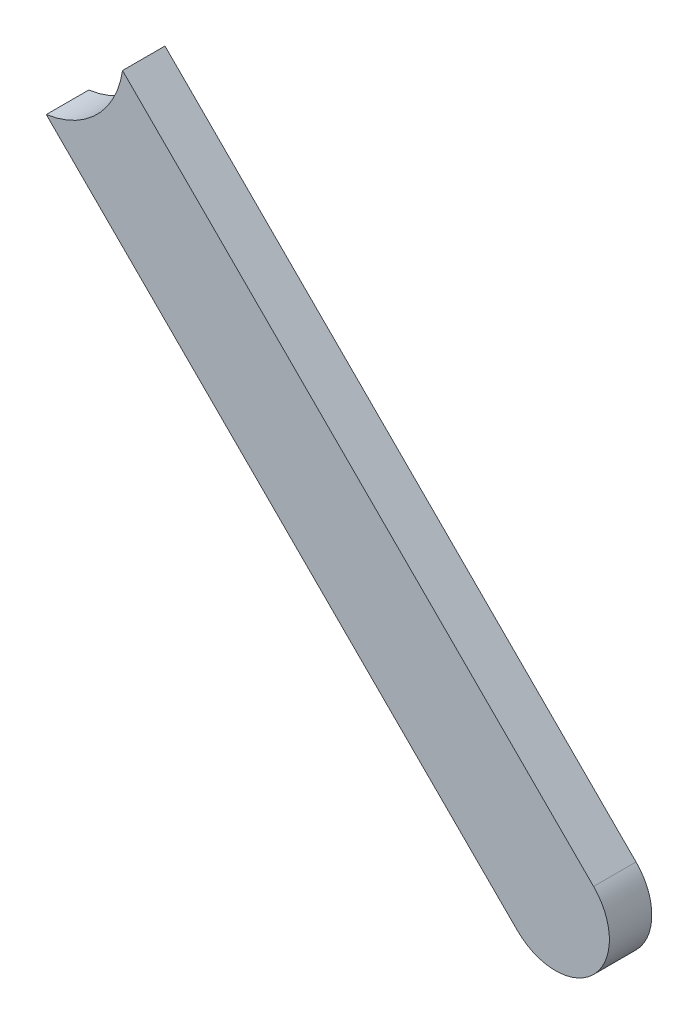
ISO-10303-21;
HEADER;
FILE_DESCRIPTION(('STEP AP214'),'2;1');
FILE_NAME('part.step','',(''),(''),'','','');
FILE_SCHEMA(('AUTOMOTIVE_DESIGN { 1 0 10303 214 1 1 1 1 }'));
ENDSEC;
DATA;
#1=APPLICATION_CONTEXT('core data for automotive mechanical design processes');
#2=APPLICATION_PROTOCOL_DEFINITION('international standard','automotive_design',2000,#1);
#3=PRODUCT_CONTEXT('',#1,'mechanical');
#4=PRODUCT('Part','Part','',(#3));
#5=PRODUCT_RELATED_PRODUCT_CATEGORY('part','',(#4));
#6=PRODUCT_DEFINITION_FORMATION('','',#4);
#7=PRODUCT_DEFINITION_CONTEXT('part definition',#1,'design');
#8=PRODUCT_DEFINITION('design','',#6,#7);
#9=PRODUCT_DEFINITION_SHAPE('','',#8);
#10=(LENGTH_UNIT() NAMED_UNIT(*) SI_UNIT(.MILLI.,.METRE.));
#11=(NAMED_UNIT(*) PLANE_ANGLE_UNIT() SI_UNIT($,.RADIAN.));
#12=(NAMED_UNIT(*) SI_UNIT($,.STERADIAN.) SOLID_ANGLE_UNIT());
#13=UNCERTAINTY_MEASURE_WITH_UNIT(LENGTH_MEASURE(1.E-05),#10,'distance_accuracy_value','');
#14=(GEOMETRIC_REPRESENTATION_CONTEXT(3) GLOBAL_UNCERTAINTY_ASSIGNED_CONTEXT((#13)) GLOBAL_UNIT_ASSIGNED_CONTEXT((#10,
#11,#12)) REPRESENTATION_CONTEXT('',''));
#15=CARTESIAN_POINT('',(0.,0.,0.));
#16=DIRECTION('',(0.,0.,1.));
#17=DIRECTION('',(1.,0.,0.));
#18=AXIS2_PLACEMENT_3D('',#15,#16,#17);
#19=CARTESIAN_POINT('',(103.52234603545,54.8209440845497,0.));
#20=DIRECTION('',(0.70710678118655,0.707106781186545,0.));
#21=DIRECTION('',(0.707106781186545,-0.70710678118655,0.));
#22=AXIS2_PLACEMENT_3D('',#19,#20,#21);
#23=PLANE('',#22);
#24=DIRECTION('',(0.707106781186545,-0.70710678118655,0.));
#25=VECTOR('',#24,1.);
#26=CARTESIAN_POINT('',(103.28140126,55.06188886,0.1999996));
#27=LINE('',#26,#25);
#28=CARTESIAN_POINT('',(103.52234603545,54.8209440845497,0.1999996));
#29=VERTEX_POINT('',#28);
#30=CARTESIAN_POINT('',(105.74169606,52.60159406,0.1999996));
#31=VERTEX_POINT('',#30);
#32=EDGE_CURVE('E11',#29,#31,#27,.T.);
#33=ORIENTED_EDGE('',*,*,#32,.F.);
#34=DIRECTION('',(0.,0.,1.));
#35=VECTOR('',#34,1.);
#36=CARTESIAN_POINT('',(103.52234603545,54.8209440845497,0.));
#37=LINE('',#36,#35);
#38=CARTESIAN_POINT('',(103.52234603545,54.8209440845497,0.));
#39=VERTEX_POINT('',#38);
#40=EDGE_CURVE('E24',#39,#29,#37,.T.);
#41=ORIENTED_EDGE('',*,*,#40,.F.);
#42=DIRECTION('',(0.707106781186545,-0.70710678118655,0.));
#43=VECTOR('',#42,1.);
#44=CARTESIAN_POINT('',(103.28140126,55.06188886,0.));
#45=LINE('',#44,#43);
#46=CARTESIAN_POINT('',(105.74169606,52.60159406,0.));
#47=VERTEX_POINT('',#46);
#48=EDGE_CURVE('E75',#39,#47,#45,.T.);
#49=ORIENTED_EDGE('',*,*,#48,.T.);
#50=DIRECTION('',(0.,0.,1.));
#51=VECTOR('',#50,1.);
#52=CARTESIAN_POINT('',(105.74169606,52.60159406,0.));
#53=LINE('',#52,#51);
#54=EDGE_CURVE('E37',#47,#31,#53,.T.);
#55=ORIENTED_EDGE('',*,*,#54,.T.);
#56=EDGE_LOOP('',(#33,#41,#49,#55));
#57=FACE_BOUND('',#56,.T.);
#58=ADVANCED_FACE('F17',(#57),#23,.F.);
#59=CARTESIAN_POINT('',(105.921302,52.7812,0.));
#60=DIRECTION('',(0.,0.,-1.));
#61=DIRECTION('',(-0.707106781186576,-0.70710678118652,0.));
#62=AXIS2_PLACEMENT_3D('',#59,#60,#61);
#63=CYLINDRICAL_SURFACE('',#62,0.254001156230774);
#64=CARTESIAN_POINT('',(105.921302,52.7812,0.1999996));
#65=DIRECTION('',(0.,0.,1.));
#66=DIRECTION('',(-0.707106781186576,-0.70710678118652,0.));
#67=AXIS2_PLACEMENT_3D('',#64,#65,#66);
#68=CIRCLE('',#67,0.254001156230774);
#69=CARTESIAN_POINT('',(106.10090794,52.96080594,0.1999996));
#70=VERTEX_POINT('',#69);
#71=EDGE_CURVE('E83',#31,#70,#68,.T.);
#72=ORIENTED_EDGE('',*,*,#71,.F.);
#73=ORIENTED_EDGE('',*,*,#54,.F.);
#74=CARTESIAN_POINT('',(105.921302,52.7812,0.));
#75=DIRECTION('',(0.,0.,1.));
#76=DIRECTION('',(-0.707106781186576,-0.70710678118652,0.));
#77=AXIS2_PLACEMENT_3D('',#74,#75,#76);
#78=CIRCLE('',#77,0.254001156230774);
#79=CARTESIAN_POINT('',(106.10090794,52.96080594,0.));
#80=VERTEX_POINT('',#79);
#81=EDGE_CURVE('E81',#47,#80,#78,.T.);
#82=ORIENTED_EDGE('',*,*,#81,.T.);
#83=DIRECTION('',(0.,0.,1.));
#84=VECTOR('',#83,1.);
#85=CARTESIAN_POINT('',(106.10090794,52.96080594,0.));
#86=LINE('',#85,#84);
#87=EDGE_CURVE('E67',#80,#70,#86,.T.);
#88=ORIENTED_EDGE('',*,*,#87,.T.);
#89=EDGE_LOOP('',(#72,#73,#82,#88));
#90=FACE_BOUND('',#89,.T.);
#91=ADVANCED_FACE('F89',(#90),#63,.T.);
#92=CARTESIAN_POINT('',(106.10090794,52.96080594,0.));
#93=DIRECTION('',(-0.707106781186548,-0.707106781186548,0.));
#94=DIRECTION('',(-0.707106781186548,0.707106781186548,0.));
#95=AXIS2_PLACEMENT_3D('',#92,#93,#94);
#96=PLANE('',#95);
#97=DIRECTION('',(-0.707106781186548,0.707106781186548,0.));
#98=VECTOR('',#97,1.);
#99=CARTESIAN_POINT('',(106.10090794,52.96080594,0.1999996));
#100=LINE('',#99,#98);
#101=CARTESIAN_POINT('',(103.88155791545,55.1801559645497,0.1999996));
#102=VERTEX_POINT('',#101);
#103=EDGE_CURVE('E71',#70,#102,#100,.T.);
#104=ORIENTED_EDGE('',*,*,#103,.F.);
#105=ORIENTED_EDGE('',*,*,#87,.F.);
#106=DIRECTION('',(-0.707106781186548,0.707106781186548,0.));
#107=VECTOR('',#106,1.);
#108=CARTESIAN_POINT('',(106.10090794,52.96080594,0.));
#109=LINE('',#108,#107);
#110=CARTESIAN_POINT('',(103.88155791545,55.1801559645497,0.));
#111=VERTEX_POINT('',#110);
#112=EDGE_CURVE('E63',#80,#111,#109,.T.);
#113=ORIENTED_EDGE('',*,*,#112,.T.);
#114=DIRECTION('',(0.,0.,1.));
#115=VECTOR('',#114,1.);
#116=CARTESIAN_POINT('',(103.88155791545,55.1801559645497,0.));
#117=LINE('',#116,#115);
#118=EDGE_CURVE('E53',#111,#102,#117,.T.);
#119=ORIENTED_EDGE('',*,*,#118,.T.);
#120=EDGE_LOOP('',(#104,#105,#113,#119));
#121=FACE_BOUND('',#120,.T.);
#122=ADVANCED_FACE('F66',(#121),#96,.F.);
#123=CARTESIAN_POINT('',(103.4610072,55.2414948,0.));
#124=DIRECTION('',(0.,0.,-1.));
#125=DIRECTION('',(1.,0.,0.));
#126=AXIS2_PLACEMENT_3D('',#123,#124,#125);
#127=CYLINDRICAL_SURFACE('',#126,0.42500042);
#128=ORIENTED_EDGE('',*,*,#40,.T.);
#129=CARTESIAN_POINT('',(103.4610072,55.2414948,0.1999996));
#130=DIRECTION('',(0.,0.,1.));
#131=DIRECTION('',(1.,0.,0.));
#132=AXIS2_PLACEMENT_3D('',#129,#130,#131);
#133=CIRCLE('',#132,0.42500042);
#134=EDGE_CURVE('E59',#29,#102,#133,.T.);
#135=ORIENTED_EDGE('',*,*,#134,.T.);
#136=ORIENTED_EDGE('',*,*,#118,.F.);
#137=CARTESIAN_POINT('',(103.4610072,55.2414948,0.));
#138=DIRECTION('',(0.,0.,1.));
#139=DIRECTION('',(1.,0.,0.));
#140=AXIS2_PLACEMENT_3D('',#137,#138,#139);
#141=CIRCLE('',#140,0.42500042);
#142=EDGE_CURVE('E57',#39,#111,#141,.T.);
#143=ORIENTED_EDGE('',*,*,#142,.F.);
#144=EDGE_LOOP('',(#128,#135,#136,#143));
#145=FACE_BOUND('',#144,.T.);
#146=ADVANCED_FACE('F55',(#145),#127,.F.);
#147=CARTESIAN_POINT('',(103.28140126,55.06188886,0.));
#148=DIRECTION('',(0.,0.,-1.));
#149=DIRECTION('',(-1.,0.,0.));
#150=AXIS2_PLACEMENT_3D('',#147,#148,#149);
#151=PLANE('',#150);
#152=ORIENTED_EDGE('',*,*,#48,.F.);
#153=ORIENTED_EDGE('',*,*,#142,.T.);
#154=ORIENTED_EDGE('',*,*,#112,.F.);
#155=ORIENTED_EDGE('',*,*,#81,.F.);
#156=EDGE_LOOP('',(#152,#153,#154,#155));
#157=FACE_BOUND('',#156,.T.);
#158=ADVANCED_FACE('F74',(#157),#151,.T.);
#159=CARTESIAN_POINT('',(103.28140126,55.06188886,0.1999996));
#160=DIRECTION('',(0.,0.,-1.));
#161=DIRECTION('',(-1.,0.,0.));
#162=AXIS2_PLACEMENT_3D('',#159,#160,#161);
#163=PLANE('',#162);
#164=ORIENTED_EDGE('',*,*,#134,.F.);
#165=ORIENTED_EDGE('',*,*,#32,.T.);
#166=ORIENTED_EDGE('',*,*,#71,.T.);
#167=ORIENTED_EDGE('',*,*,#103,.T.);
#168=EDGE_LOOP('',(#164,#165,#166,#167));
#169=FACE_BOUND('',#168,.T.);
#170=ADVANCED_FACE('F91',(#169),#163,.F.);
#171=CLOSED_SHELL('',(#58,#91,#122,#146,#158,#170));
#172=MANIFOLD_SOLID_BREP('B1',#171);
#173=ADVANCED_BREP_SHAPE_REPRESENTATION('',(#18,#172),#14);
#174=SHAPE_DEFINITION_REPRESENTATION(#9,#173);
ENDSEC;
END-ISO-10303-21;
